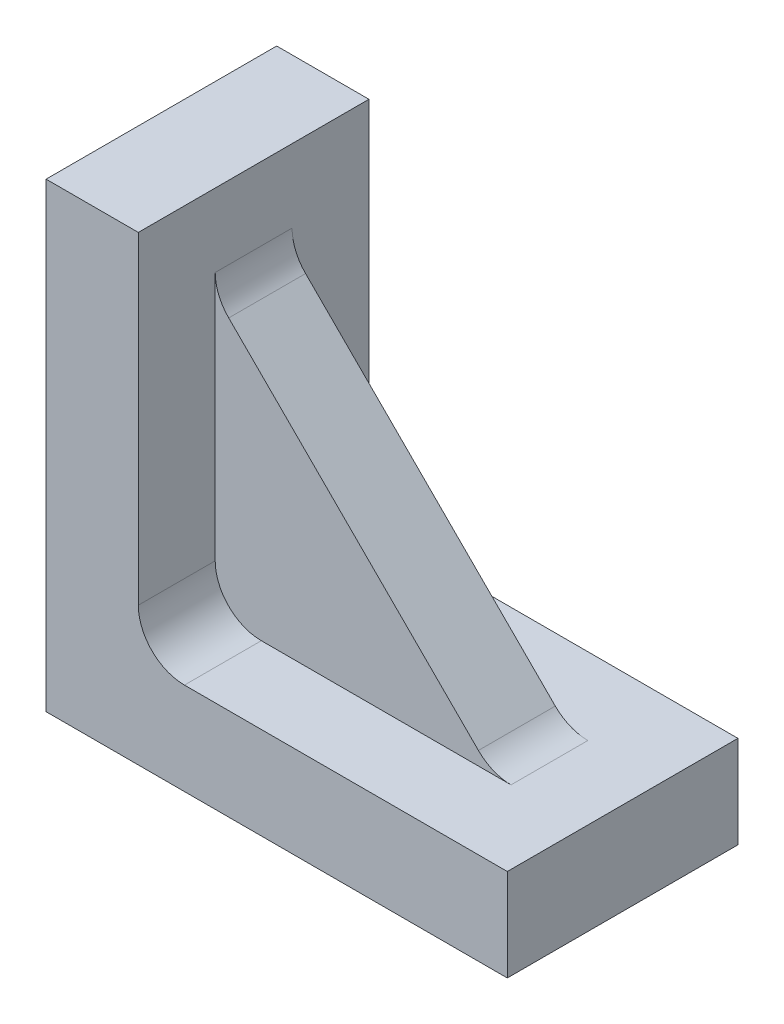
ISO-10303-21;
HEADER;
FILE_DESCRIPTION(('STEP AP214'),'2;1');
FILE_NAME('part.step','',(''),(''),'','','');
FILE_SCHEMA(('AUTOMOTIVE_DESIGN { 1 0 10303 214 1 1 1 1 }'));
ENDSEC;
DATA;
#1=APPLICATION_CONTEXT('core data for automotive mechanical design processes');
#2=APPLICATION_PROTOCOL_DEFINITION('international standard','automotive_design',2000,#1);
#3=PRODUCT_CONTEXT('',#1,'mechanical');
#4=PRODUCT('Part','Part','',(#3));
#5=PRODUCT_RELATED_PRODUCT_CATEGORY('part','',(#4));
#6=PRODUCT_DEFINITION_FORMATION('','',#4);
#7=PRODUCT_DEFINITION_CONTEXT('part definition',#1,'design');
#8=PRODUCT_DEFINITION('design','',#6,#7);
#9=PRODUCT_DEFINITION_SHAPE('','',#8);
#10=(LENGTH_UNIT() NAMED_UNIT(*) SI_UNIT(.MILLI.,.METRE.));
#11=(NAMED_UNIT(*) PLANE_ANGLE_UNIT() SI_UNIT($,.RADIAN.));
#12=(NAMED_UNIT(*) SI_UNIT($,.STERADIAN.) SOLID_ANGLE_UNIT());
#13=UNCERTAINTY_MEASURE_WITH_UNIT(LENGTH_MEASURE(1.E-05),#10,'distance_accuracy_value','');
#14=(GEOMETRIC_REPRESENTATION_CONTEXT(3) GLOBAL_UNCERTAINTY_ASSIGNED_CONTEXT((#13)) GLOBAL_UNIT_ASSIGNED_CONTEXT((#10,
#11,#12)) REPRESENTATION_CONTEXT('',''));
#15=CARTESIAN_POINT('',(0.,0.,0.));
#16=DIRECTION('',(0.,0.,1.));
#17=DIRECTION('',(1.,0.,0.));
#18=AXIS2_PLACEMENT_3D('',#15,#16,#17);
#19=CARTESIAN_POINT('',(-16.9171518609141,-16.9171518609141,25.4));
#20=DIRECTION('',(0.,1.,0.));
#21=DIRECTION('',(0.,0.,1.));
#22=AXIS2_PLACEMENT_3D('',#19,#20,#21);
#23=PLANE('',#22);
#24=DIRECTION('',(1.,0.,0.));
#25=VECTOR('',#24,1.);
#26=CARTESIAN_POINT('',(-16.9171518609141,-16.9171518609141,-12.7));
#27=LINE('',#26,#25);
#28=CARTESIAN_POINT('',(-16.9171518609141,-16.9171518609141,-12.7));
#29=VERTEX_POINT('',#28);
#30=CARTESIAN_POINT('',(59.2828481390859,-16.9171518609141,-12.7));
#31=VERTEX_POINT('',#30);
#32=EDGE_CURVE('E155',#29,#31,#27,.T.);
#33=ORIENTED_EDGE('',*,*,#32,.T.);
#34=DIRECTION('',(0.,0.,-1.));
#35=VECTOR('',#34,1.);
#36=CARTESIAN_POINT('',(59.2828481390859,-16.9171518609141,25.4));
#37=LINE('',#36,#35);
#38=CARTESIAN_POINT('',(59.2828481390859,-16.9171518609141,25.4));
#39=VERTEX_POINT('',#38);
#40=EDGE_CURVE('E136',#39,#31,#37,.T.);
#41=ORIENTED_EDGE('',*,*,#40,.F.);
#42=DIRECTION('',(1.,0.,0.));
#43=VECTOR('',#42,1.);
#44=CARTESIAN_POINT('',(-16.9171518609141,-16.9171518609141,25.4));
#45=LINE('',#44,#43);
#46=CARTESIAN_POINT('',(-16.9171518609141,-16.9171518609141,25.4));
#47=VERTEX_POINT('',#46);
#48=EDGE_CURVE('E143',#47,#39,#45,.T.);
#49=ORIENTED_EDGE('',*,*,#48,.F.);
#50=DIRECTION('',(0.,0.,-1.));
#51=VECTOR('',#50,1.);
#52=CARTESIAN_POINT('',(-16.9171518609141,-16.9171518609141,25.4));
#53=LINE('',#52,#51);
#54=EDGE_CURVE('E243',#47,#29,#53,.T.);
#55=ORIENTED_EDGE('',*,*,#54,.T.);
#56=EDGE_LOOP('',(#33,#41,#49,#55));
#57=FACE_BOUND('',#56,.T.);
#58=ADVANCED_FACE('F35',(#57),#23,.F.);
#59=CARTESIAN_POINT('',(59.2828481390859,-16.9171518609141,25.4));
#60=DIRECTION('',(-1.,0.,0.));
#61=DIRECTION('',(0.,0.,1.));
#62=AXIS2_PLACEMENT_3D('',#59,#60,#61);
#63=PLANE('',#62);
#64=DIRECTION('',(0.,1.,0.));
#65=VECTOR('',#64,1.);
#66=CARTESIAN_POINT('',(59.2828481390859,-16.9171518609141,-12.7));
#67=LINE('',#66,#65);
#68=CARTESIAN_POINT('',(59.2828481390859,-1.6771518609141,-12.7));
#69=VERTEX_POINT('',#68);
#70=EDGE_CURVE('E238',#31,#69,#67,.T.);
#71=ORIENTED_EDGE('',*,*,#70,.T.);
#72=DIRECTION('',(0.,0.,-1.));
#73=VECTOR('',#72,1.);
#74=CARTESIAN_POINT('',(59.2828481390859,-1.6771518609141,25.4));
#75=LINE('',#74,#73);
#76=CARTESIAN_POINT('',(59.2828481390859,-1.6771518609141,25.4));
#77=VERTEX_POINT('',#76);
#78=EDGE_CURVE('E138',#77,#69,#75,.T.);
#79=ORIENTED_EDGE('',*,*,#78,.F.);
#80=DIRECTION('',(0.,1.,0.));
#81=VECTOR('',#80,1.);
#82=CARTESIAN_POINT('',(59.2828481390859,-16.9171518609141,25.4));
#83=LINE('',#82,#81);
#84=EDGE_CURVE('E131',#39,#77,#83,.T.);
#85=ORIENTED_EDGE('',*,*,#84,.F.);
#86=ORIENTED_EDGE('',*,*,#40,.T.);
#87=EDGE_LOOP('',(#71,#79,#85,#86));
#88=FACE_BOUND('',#87,.T.);
#89=ADVANCED_FACE('F134',(#88),#63,.F.);
#90=CARTESIAN_POINT('',(59.2828481390859,-1.6771518609141,25.4));
#91=DIRECTION('',(0.,-1.,0.));
#92=DIRECTION('',(1.,0.,0.));
#93=AXIS2_PLACEMENT_3D('',#90,#91,#92);
#94=PLANE('',#93);
#95=DIRECTION('',(1.,0.,0.));
#96=VECTOR('',#95,1.);
#97=CARTESIAN_POINT('',(-1.67715186091408,-1.6771518609141,0.));
#98=LINE('',#97,#96);
#99=CARTESIAN_POINT('',(5.94284813908597,-1.6771518609141,0.));
#100=VERTEX_POINT('',#99);
#101=CARTESIAN_POINT('',(47.1991554843689,-1.6771518609141,0.));
#102=VERTEX_POINT('',#101);
#103=EDGE_CURVE('E215',#100,#102,#98,.T.);
#104=ORIENTED_EDGE('',*,*,#103,.T.);
#105=DIRECTION('',(0.,0.,-1.));
#106=VECTOR('',#105,1.);
#107=CARTESIAN_POINT('',(47.1991554843689,-1.6771518609141,12.7));
#108=LINE('',#107,#106);
#109=CARTESIAN_POINT('',(47.1991554843689,-1.6771518609141,12.7));
#110=VERTEX_POINT('',#109);
#111=EDGE_CURVE('E189',#102,#110,#108,.F.);
#112=ORIENTED_EDGE('',*,*,#111,.T.);
#113=DIRECTION('',(1.,0.,0.));
#114=VECTOR('',#113,1.);
#115=CARTESIAN_POINT('',(-1.67715186091408,-1.6771518609141,12.7));
#116=LINE('',#115,#114);
#117=CARTESIAN_POINT('',(5.94284813908597,-1.6771518609141,12.7));
#118=VERTEX_POINT('',#117);
#119=EDGE_CURVE('E261',#118,#110,#116,.T.);
#120=ORIENTED_EDGE('',*,*,#119,.F.);
#121=DIRECTION('',(0.,0.,-1.));
#122=VECTOR('',#121,1.);
#123=CARTESIAN_POINT('',(5.94284813908597,-1.67715186091411,25.4));
#124=LINE('',#123,#122);
#125=CARTESIAN_POINT('',(5.94284813908598,-1.67715186091411,25.4));
#126=VERTEX_POINT('',#125);
#127=EDGE_CURVE('E172',#118,#126,#124,.F.);
#128=ORIENTED_EDGE('',*,*,#127,.T.);
#129=DIRECTION('',(-1.,0.,0.));
#130=VECTOR('',#129,1.);
#131=CARTESIAN_POINT('',(59.2828481390859,-1.6771518609141,25.4));
#132=LINE('',#131,#130);
#133=EDGE_CURVE('E142',#77,#126,#132,.T.);
#134=ORIENTED_EDGE('',*,*,#133,.F.);
#135=ORIENTED_EDGE('',*,*,#78,.T.);
#136=DIRECTION('',(-1.,0.,0.));
#137=VECTOR('',#136,1.);
#138=CARTESIAN_POINT('',(59.2828481390859,-1.6771518609141,-12.7));
#139=LINE('',#138,#137);
#140=CARTESIAN_POINT('',(5.94284813908598,-1.67715186091411,-12.7));
#141=VERTEX_POINT('',#140);
#142=EDGE_CURVE('E235',#69,#141,#139,.T.);
#143=ORIENTED_EDGE('',*,*,#142,.T.);
#144=DIRECTION('',(0.,0.,-1.));
#145=VECTOR('',#144,1.);
#146=CARTESIAN_POINT('',(5.94284813908597,-1.67715186091411,0.));
#147=LINE('',#146,#145);
#148=EDGE_CURVE('E174',#141,#100,#147,.F.);
#149=ORIENTED_EDGE('',*,*,#148,.T.);
#150=EDGE_LOOP('',(#104,#112,#120,#128,#134,#135,#143,#149));
#151=FACE_BOUND('',#150,.T.);
#152=ADVANCED_FACE('F262',(#151),#94,.F.);
#153=CARTESIAN_POINT('',(44.0428481390859,-1.6771518609141,25.4));
#154=DIRECTION('',(-0.707106781186547,-0.707106781186548,0.));
#155=DIRECTION('',(0.707106781186548,-0.707106781186547,0.));
#156=AXIS2_PLACEMENT_3D('',#153,#154,#155);
#157=PLANE('',#156);
#158=DIRECTION('',(0.707106781186548,-0.707106781186547,0.));
#159=VECTOR('',#158,1.);
#160=CARTESIAN_POINT('',(44.0428481390859,-1.6771518609141,12.7));
#161=LINE('',#160,#159);
#162=CARTESIAN_POINT('',(0.554694466444417,41.8110018117274,12.7));
#163=VERTEX_POINT('',#162);
#164=CARTESIAN_POINT('',(41.8110018117274,0.554694466444404,12.7));
#165=VERTEX_POINT('',#164);
#166=EDGE_CURVE('E159',#163,#165,#161,.T.);
#167=ORIENTED_EDGE('',*,*,#166,.T.);
#168=DIRECTION('',(0.,0.,-1.));
#169=VECTOR('',#168,1.);
#170=CARTESIAN_POINT('',(41.8110018117274,0.554694466444404,0.));
#171=LINE('',#170,#169);
#172=CARTESIAN_POINT('',(41.8110018117274,0.554694466444407,0.));
#173=VERTEX_POINT('',#172);
#174=EDGE_CURVE('E186',#165,#173,#171,.T.);
#175=ORIENTED_EDGE('',*,*,#174,.T.);
#176=DIRECTION('',(-0.707106781186548,0.707106781186547,0.));
#177=VECTOR('',#176,1.);
#178=CARTESIAN_POINT('',(44.0428481390859,-1.6771518609141,0.));
#179=LINE('',#178,#177);
#180=CARTESIAN_POINT('',(0.554694466444433,41.8110018117274,0.));
#181=VERTEX_POINT('',#180);
#182=EDGE_CURVE('E156',#173,#181,#179,.T.);
#183=ORIENTED_EDGE('',*,*,#182,.T.);
#184=DIRECTION('',(0.,0.,-1.));
#185=VECTOR('',#184,1.);
#186=CARTESIAN_POINT('',(0.554694466444431,41.8110018117274,12.7));
#187=LINE('',#186,#185);
#188=EDGE_CURVE('E184',#181,#163,#187,.F.);
#189=ORIENTED_EDGE('',*,*,#188,.T.);
#190=EDGE_LOOP('',(#167,#175,#183,#189));
#191=FACE_BOUND('',#190,.T.);
#192=ADVANCED_FACE('F205',(#191),#157,.F.);
#193=CARTESIAN_POINT('',(-1.67715186091409,59.2828481390859,25.4));
#194=DIRECTION('',(-1.,0.,0.));
#195=DIRECTION('',(0.,-1.,0.));
#196=AXIS2_PLACEMENT_3D('',#193,#194,#195);
#197=PLANE('',#196);
#198=DIRECTION('',(0.,0.,-1.));
#199=VECTOR('',#198,1.);
#200=CARTESIAN_POINT('',(-1.67715186091407,47.1991554843689,0.));
#201=LINE('',#200,#199);
#202=CARTESIAN_POINT('',(-1.67715186091408,47.1991554843689,12.7));
#203=VERTEX_POINT('',#202);
#204=CARTESIAN_POINT('',(-1.67715186091407,47.1991554843689,0.));
#205=VERTEX_POINT('',#204);
#206=EDGE_CURVE('E192',#203,#205,#201,.T.);
#207=ORIENTED_EDGE('',*,*,#206,.T.);
#208=DIRECTION('',(0.,-1.,0.));
#209=VECTOR('',#208,1.);
#210=CARTESIAN_POINT('',(-1.67715186091408,44.0428481390858,0.));
#211=LINE('',#210,#209);
#212=CARTESIAN_POINT('',(-1.67715186091408,5.94284813908587,0.));
#213=VERTEX_POINT('',#212);
#214=EDGE_CURVE('E50',#205,#213,#211,.T.);
#215=ORIENTED_EDGE('',*,*,#214,.T.);
#216=DIRECTION('',(0.,0.,-1.));
#217=VECTOR('',#216,1.);
#218=CARTESIAN_POINT('',(-1.67715186091402,5.94284813908588,-12.7));
#219=LINE('',#218,#217);
#220=CARTESIAN_POINT('',(-1.67715186091403,5.94284813908587,-12.7));
#221=VERTEX_POINT('',#220);
#222=EDGE_CURVE('E169',#213,#221,#219,.T.);
#223=ORIENTED_EDGE('',*,*,#222,.T.);
#224=DIRECTION('',(0.,1.,0.));
#225=VECTOR('',#224,1.);
#226=CARTESIAN_POINT('',(-1.67715186091409,59.2828481390859,-12.7));
#227=LINE('',#226,#225);
#228=CARTESIAN_POINT('',(-1.67715186091409,59.2828481390859,-12.7));
#229=VERTEX_POINT('',#228);
#230=EDGE_CURVE('E226',#221,#229,#227,.T.);
#231=ORIENTED_EDGE('',*,*,#230,.T.);
#232=DIRECTION('',(0.,0.,-1.));
#233=VECTOR('',#232,1.);
#234=CARTESIAN_POINT('',(-1.67715186091409,59.2828481390859,25.4));
#235=LINE('',#234,#233);
#236=CARTESIAN_POINT('',(-1.67715186091409,59.2828481390859,25.4));
#237=VERTEX_POINT('',#236);
#238=EDGE_CURVE('E161',#237,#229,#235,.T.);
#239=ORIENTED_EDGE('',*,*,#238,.F.);
#240=DIRECTION('',(0.,1.,0.));
#241=VECTOR('',#240,1.);
#242=CARTESIAN_POINT('',(-1.67715186091409,59.2828481390859,25.4));
#243=LINE('',#242,#241);
#244=CARTESIAN_POINT('',(-1.67715186091403,5.94284813908587,25.4));
#245=VERTEX_POINT('',#244);
#246=EDGE_CURVE('E253',#245,#237,#243,.T.);
#247=ORIENTED_EDGE('',*,*,#246,.F.);
#248=DIRECTION('',(0.,0.,-1.));
#249=VECTOR('',#248,1.);
#250=CARTESIAN_POINT('',(-1.67715186091402,5.94284813908588,12.7));
#251=LINE('',#250,#249);
#252=CARTESIAN_POINT('',(-1.67715186091408,5.94284813908587,12.7));
#253=VERTEX_POINT('',#252);
#254=EDGE_CURVE('E167',#245,#253,#251,.T.);
#255=ORIENTED_EDGE('',*,*,#254,.T.);
#256=DIRECTION('',(0.,1.,0.));
#257=VECTOR('',#256,1.);
#258=CARTESIAN_POINT('',(-1.67715186091408,44.0428481390858,12.7));
#259=LINE('',#258,#257);
#260=EDGE_CURVE('E58',#253,#203,#259,.T.);
#261=ORIENTED_EDGE('',*,*,#260,.T.);
#262=EDGE_LOOP('',(#207,#215,#223,#231,#239,#247,#255,#261));
#263=FACE_BOUND('',#262,.T.);
#264=ADVANCED_FACE('F224',(#263),#197,.F.);
#265=CARTESIAN_POINT('',(-16.9171518609141,59.2828481390859,25.4));
#266=DIRECTION('',(0.,-1.,0.));
#267=DIRECTION('',(0.,0.,-1.));
#268=AXIS2_PLACEMENT_3D('',#265,#266,#267);
#269=PLANE('',#268);
#270=DIRECTION('',(-1.,0.,0.));
#271=VECTOR('',#270,1.);
#272=CARTESIAN_POINT('',(-16.9171518609141,59.2828481390859,-12.7));
#273=LINE('',#272,#271);
#274=CARTESIAN_POINT('',(-16.9171518609141,59.2828481390859,-12.7));
#275=VERTEX_POINT('',#274);
#276=EDGE_CURVE('E234',#229,#275,#273,.T.);
#277=ORIENTED_EDGE('',*,*,#276,.T.);
#278=DIRECTION('',(0.,0.,-1.));
#279=VECTOR('',#278,1.);
#280=CARTESIAN_POINT('',(-16.9171518609141,59.2828481390859,25.4));
#281=LINE('',#280,#279);
#282=CARTESIAN_POINT('',(-16.9171518609141,59.2828481390859,25.4));
#283=VERTEX_POINT('',#282);
#284=EDGE_CURVE('E245',#283,#275,#281,.T.);
#285=ORIENTED_EDGE('',*,*,#284,.F.);
#286=DIRECTION('',(-1.,0.,0.));
#287=VECTOR('',#286,1.);
#288=CARTESIAN_POINT('',(-16.9171518609141,59.2828481390859,25.4));
#289=LINE('',#288,#287);
#290=EDGE_CURVE('E251',#237,#283,#289,.T.);
#291=ORIENTED_EDGE('',*,*,#290,.F.);
#292=ORIENTED_EDGE('',*,*,#238,.T.);
#293=EDGE_LOOP('',(#277,#285,#291,#292));
#294=FACE_BOUND('',#293,.T.);
#295=ADVANCED_FACE('F249',(#294),#269,.F.);
#296=CARTESIAN_POINT('',(-16.9171518609141,-16.9171518609141,25.4));
#297=DIRECTION('',(1.,0.,0.));
#298=DIRECTION('',(0.,0.,-1.));
#299=AXIS2_PLACEMENT_3D('',#296,#297,#298);
#300=PLANE('',#299);
#301=DIRECTION('',(0.,-1.,0.));
#302=VECTOR('',#301,1.);
#303=CARTESIAN_POINT('',(-16.9171518609141,-16.9171518609141,-12.7));
#304=LINE('',#303,#302);
#305=EDGE_CURVE('E152',#275,#29,#304,.T.);
#306=ORIENTED_EDGE('',*,*,#305,.T.);
#307=ORIENTED_EDGE('',*,*,#54,.F.);
#308=DIRECTION('',(0.,-1.,0.));
#309=VECTOR('',#308,1.);
#310=CARTESIAN_POINT('',(-16.9171518609141,-16.9171518609141,25.4));
#311=LINE('',#310,#309);
#312=EDGE_CURVE('E148',#283,#47,#311,.T.);
#313=ORIENTED_EDGE('',*,*,#312,.F.);
#314=ORIENTED_EDGE('',*,*,#284,.T.);
#315=EDGE_LOOP('',(#306,#307,#313,#314));
#316=FACE_BOUND('',#315,.T.);
#317=ADVANCED_FACE('F271',(#316),#300,.F.);
#318=CARTESIAN_POINT('',(-16.9171518609141,-16.9171518609141,25.4));
#319=DIRECTION('',(0.,0.,1.));
#320=DIRECTION('',(1.,0.,0.));
#321=AXIS2_PLACEMENT_3D('',#318,#319,#320);
#322=PLANE('',#321);
#323=ORIENTED_EDGE('',*,*,#133,.T.);
#324=CARTESIAN_POINT('',(5.94284813908597,5.94284813908589,25.4));
#325=DIRECTION('',(0.,0.,1.));
#326=DIRECTION('',(1.,0.,0.));
#327=AXIS2_PLACEMENT_3D('',#324,#325,#326);
#328=CIRCLE('',#327,7.62);
#329=EDGE_CURVE('E182',#126,#245,#328,.F.);
#330=ORIENTED_EDGE('',*,*,#329,.T.);
#331=ORIENTED_EDGE('',*,*,#246,.T.);
#332=ORIENTED_EDGE('',*,*,#290,.T.);
#333=ORIENTED_EDGE('',*,*,#312,.T.);
#334=ORIENTED_EDGE('',*,*,#48,.T.);
#335=ORIENTED_EDGE('',*,*,#84,.T.);
#336=EDGE_LOOP('',(#323,#330,#331,#332,#333,#334,#335));
#337=FACE_BOUND('',#336,.T.);
#338=ADVANCED_FACE('F146',(#337),#322,.T.);
#339=CARTESIAN_POINT('',(-16.9171518609141,-16.9171518609141,-12.7));
#340=DIRECTION('',(0.,0.,1.));
#341=DIRECTION('',(1.,0.,0.));
#342=AXIS2_PLACEMENT_3D('',#339,#340,#341);
#343=PLANE('',#342);
#344=ORIENTED_EDGE('',*,*,#230,.F.);
#345=CARTESIAN_POINT('',(5.94284813908597,5.94284813908589,-12.7));
#346=DIRECTION('',(0.,0.,1.));
#347=DIRECTION('',(1.,0.,0.));
#348=AXIS2_PLACEMENT_3D('',#345,#346,#347);
#349=CIRCLE('',#348,7.62);
#350=EDGE_CURVE('E180',#221,#141,#349,.T.);
#351=ORIENTED_EDGE('',*,*,#350,.T.);
#352=ORIENTED_EDGE('',*,*,#142,.F.);
#353=ORIENTED_EDGE('',*,*,#70,.F.);
#354=ORIENTED_EDGE('',*,*,#32,.F.);
#355=ORIENTED_EDGE('',*,*,#305,.F.);
#356=ORIENTED_EDGE('',*,*,#276,.F.);
#357=EDGE_LOOP('',(#344,#351,#352,#353,#354,#355,#356));
#358=FACE_BOUND('',#357,.T.);
#359=ADVANCED_FACE('F230',(#358),#343,.F.);
#360=CARTESIAN_POINT('',(-1.67715186091408,44.0428481390858,0.));
#361=DIRECTION('',(0.,0.,1.));
#362=DIRECTION('',(0.,-1.,0.));
#363=AXIS2_PLACEMENT_3D('',#360,#361,#362);
#364=PLANE('',#363);
#365=ORIENTED_EDGE('',*,*,#103,.F.);
#366=CARTESIAN_POINT('',(5.94284813908597,5.94284813908589,0.));
#367=DIRECTION('',(0.,0.,1.));
#368=DIRECTION('',(0.,-1.,0.));
#369=AXIS2_PLACEMENT_3D('',#366,#367,#368);
#370=CIRCLE('',#369,7.62);
#371=EDGE_CURVE('E176',#100,#213,#370,.F.);
#372=ORIENTED_EDGE('',*,*,#371,.T.);
#373=ORIENTED_EDGE('',*,*,#214,.F.);
#374=CARTESIAN_POINT('',(5.94284813908593,47.1991554843689,0.));
#375=DIRECTION('',(0.,0.,1.));
#376=DIRECTION('',(0.,-1.,0.));
#377=AXIS2_PLACEMENT_3D('',#374,#375,#376);
#378=CIRCLE('',#377,7.62);
#379=EDGE_CURVE('E43',#205,#181,#378,.T.);
#380=ORIENTED_EDGE('',*,*,#379,.T.);
#381=ORIENTED_EDGE('',*,*,#182,.F.);
#382=CARTESIAN_POINT('',(47.1991554843689,5.9428481390859,0.));
#383=DIRECTION('',(0.,0.,1.));
#384=DIRECTION('',(0.,-1.,0.));
#385=AXIS2_PLACEMENT_3D('',#382,#383,#384);
#386=CIRCLE('',#385,7.62);
#387=EDGE_CURVE('E194',#173,#102,#386,.T.);
#388=ORIENTED_EDGE('',*,*,#387,.T.);
#389=EDGE_LOOP('',(#365,#372,#373,#380,#381,#388));
#390=FACE_BOUND('',#389,.T.);
#391=ADVANCED_FACE('F200',(#390),#364,.F.);
#392=CARTESIAN_POINT('',(-1.67715186091408,44.0428481390858,12.7));
#393=DIRECTION('',(0.,0.,-1.));
#394=DIRECTION('',(0.,1.,0.));
#395=AXIS2_PLACEMENT_3D('',#392,#393,#394);
#396=PLANE('',#395);
#397=ORIENTED_EDGE('',*,*,#260,.F.);
#398=CARTESIAN_POINT('',(5.94284813908597,5.94284813908589,12.7));
#399=DIRECTION('',(0.,0.,-1.));
#400=DIRECTION('',(0.,1.,0.));
#401=AXIS2_PLACEMENT_3D('',#398,#399,#400);
#402=CIRCLE('',#401,7.62);
#403=EDGE_CURVE('E178',#253,#118,#402,.F.);
#404=ORIENTED_EDGE('',*,*,#403,.T.);
#405=ORIENTED_EDGE('',*,*,#119,.T.);
#406=CARTESIAN_POINT('',(47.1991554843689,5.9428481390859,12.7));
#407=DIRECTION('',(0.,0.,-1.));
#408=DIRECTION('',(0.,1.,0.));
#409=AXIS2_PLACEMENT_3D('',#406,#407,#408);
#410=CIRCLE('',#409,7.62);
#411=EDGE_CURVE('E197',#110,#165,#410,.T.);
#412=ORIENTED_EDGE('',*,*,#411,.T.);
#413=ORIENTED_EDGE('',*,*,#166,.F.);
#414=CARTESIAN_POINT('',(5.94284813908593,47.1991554843689,12.7));
#415=DIRECTION('',(0.,0.,-1.));
#416=DIRECTION('',(0.,1.,0.));
#417=AXIS2_PLACEMENT_3D('',#414,#415,#416);
#418=CIRCLE('',#417,7.62);
#419=EDGE_CURVE('E11',#163,#203,#418,.T.);
#420=ORIENTED_EDGE('',*,*,#419,.T.);
#421=EDGE_LOOP('',(#397,#404,#405,#412,#413,#420));
#422=FACE_BOUND('',#421,.T.);
#423=ADVANCED_FACE('F210',(#422),#396,.F.);
#424=CARTESIAN_POINT('',(5.94284813908597,5.94284813908589,25.4));
#425=DIRECTION('',(0.,0.,1.));
#426=DIRECTION('',(1.,0.,0.));
#427=AXIS2_PLACEMENT_3D('',#424,#425,#426);
#428=CYLINDRICAL_SURFACE('',#427,7.62);
#429=ORIENTED_EDGE('',*,*,#371,.F.);
#430=ORIENTED_EDGE('',*,*,#148,.F.);
#431=ORIENTED_EDGE('',*,*,#350,.F.);
#432=ORIENTED_EDGE('',*,*,#222,.F.);
#433=EDGE_LOOP('',(#429,#430,#431,#432));
#434=FACE_BOUND('',#433,.T.);
#435=ADVANCED_FACE('F222',(#434),#428,.F.);
#436=CARTESIAN_POINT('',(5.94284813908597,5.94284813908589,25.4));
#437=DIRECTION('',(0.,0.,1.));
#438=DIRECTION('',(1.,0.,0.));
#439=AXIS2_PLACEMENT_3D('',#436,#437,#438);
#440=CYLINDRICAL_SURFACE('',#439,7.62);
#441=ORIENTED_EDGE('',*,*,#329,.F.);
#442=ORIENTED_EDGE('',*,*,#127,.F.);
#443=ORIENTED_EDGE('',*,*,#403,.F.);
#444=ORIENTED_EDGE('',*,*,#254,.F.);
#445=EDGE_LOOP('',(#441,#442,#443,#444));
#446=FACE_BOUND('',#445,.T.);
#447=ADVANCED_FACE('F258',(#446),#440,.F.);
#448=CARTESIAN_POINT('',(47.1991554843689,5.9428481390859,25.4));
#449=DIRECTION('',(0.,0.,1.));
#450=DIRECTION('',(1.,0.,0.));
#451=AXIS2_PLACEMENT_3D('',#448,#449,#450);
#452=CYLINDRICAL_SURFACE('',#451,7.62);
#453=ORIENTED_EDGE('',*,*,#411,.F.);
#454=ORIENTED_EDGE('',*,*,#111,.F.);
#455=ORIENTED_EDGE('',*,*,#387,.F.);
#456=ORIENTED_EDGE('',*,*,#174,.F.);
#457=EDGE_LOOP('',(#453,#454,#455,#456));
#458=FACE_BOUND('',#457,.T.);
#459=ADVANCED_FACE('F213',(#458),#452,.F.);
#460=CARTESIAN_POINT('',(5.94284813908593,47.1991554843689,25.4));
#461=DIRECTION('',(0.,0.,1.));
#462=DIRECTION('',(1.,0.,0.));
#463=AXIS2_PLACEMENT_3D('',#460,#461,#462);
#464=CYLINDRICAL_SURFACE('',#463,7.62);
#465=ORIENTED_EDGE('',*,*,#419,.F.);
#466=ORIENTED_EDGE('',*,*,#188,.F.);
#467=ORIENTED_EDGE('',*,*,#379,.F.);
#468=ORIENTED_EDGE('',*,*,#206,.F.);
#469=EDGE_LOOP('',(#465,#466,#467,#468));
#470=FACE_BOUND('',#469,.T.);
#471=ADVANCED_FACE('F37',(#470),#464,.F.);
#472=CLOSED_SHELL('',(#58,#89,#152,#192,#264,#295,#317,#338,#359,#391,#423,#435,#447,#459,#471));
#473=MANIFOLD_SOLID_BREP('B2',#472);
#474=ADVANCED_BREP_SHAPE_REPRESENTATION('',(#18,#473),#14);
#475=SHAPE_DEFINITION_REPRESENTATION(#9,#474);
ENDSEC;
END-ISO-10303-21;
